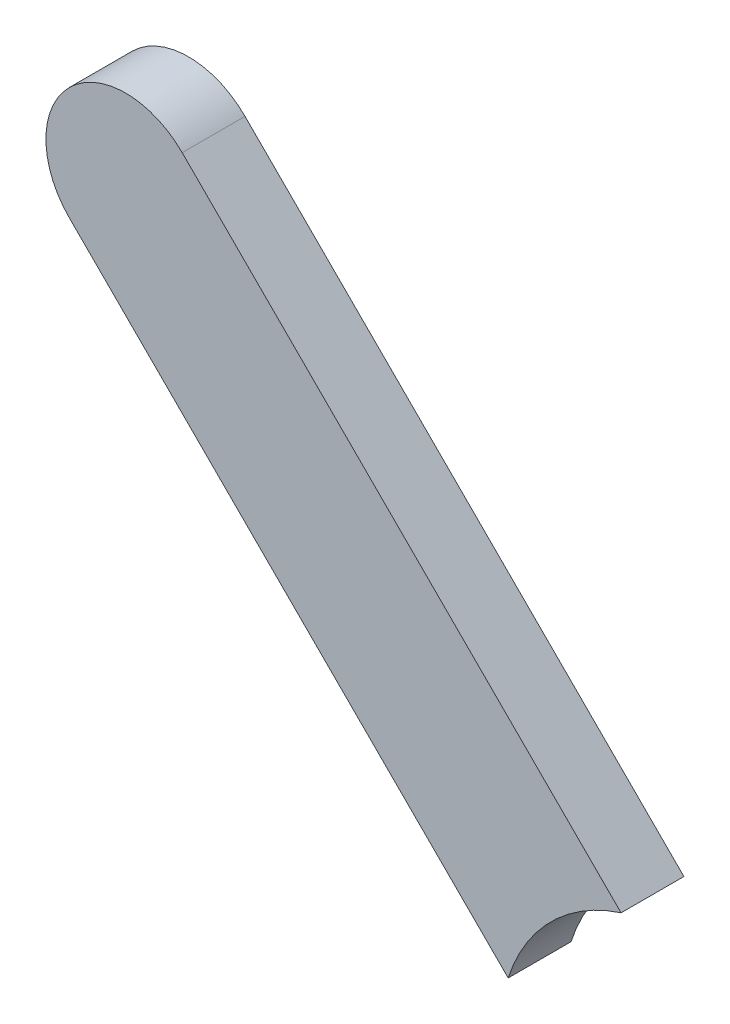
ISO-10303-21;
HEADER;
FILE_DESCRIPTION(('STEP AP214'),'2;1');
FILE_NAME('part.step','',(''),(''),'','','');
FILE_SCHEMA(('AUTOMOTIVE_DESIGN { 1 0 10303 214 1 1 1 1 }'));
ENDSEC;
DATA;
#1=APPLICATION_CONTEXT('core data for automotive mechanical design processes');
#2=APPLICATION_PROTOCOL_DEFINITION('international standard','automotive_design',2000,#1);
#3=PRODUCT_CONTEXT('',#1,'mechanical');
#4=PRODUCT('Part','Part','',(#3));
#5=PRODUCT_RELATED_PRODUCT_CATEGORY('part','',(#4));
#6=PRODUCT_DEFINITION_FORMATION('','',#4);
#7=PRODUCT_DEFINITION_CONTEXT('part definition',#1,'design');
#8=PRODUCT_DEFINITION('design','',#6,#7);
#9=PRODUCT_DEFINITION_SHAPE('','',#8);
#10=(LENGTH_UNIT() NAMED_UNIT(*) SI_UNIT(.MILLI.,.METRE.));
#11=(NAMED_UNIT(*) PLANE_ANGLE_UNIT() SI_UNIT($,.RADIAN.));
#12=(NAMED_UNIT(*) SI_UNIT($,.STERADIAN.) SOLID_ANGLE_UNIT());
#13=UNCERTAINTY_MEASURE_WITH_UNIT(LENGTH_MEASURE(1.E-05),#10,'distance_accuracy_value','');
#14=(GEOMETRIC_REPRESENTATION_CONTEXT(3) GLOBAL_UNCERTAINTY_ASSIGNED_CONTEXT((#13)) GLOBAL_UNIT_ASSIGNED_CONTEXT((#10,
#11,#12)) REPRESENTATION_CONTEXT('',''));
#15=CARTESIAN_POINT('',(0.,0.,0.));
#16=DIRECTION('',(0.,0.,1.));
#17=DIRECTION('',(1.,0.,0.));
#18=AXIS2_PLACEMENT_3D('',#15,#16,#17);
#19=CARTESIAN_POINT('',(127.09959086,110.40493286,0.));
#20=DIRECTION('',(0.707106781186548,0.707106781186548,0.));
#21=DIRECTION('',(0.707106781186548,-0.707106781186548,0.));
#22=AXIS2_PLACEMENT_3D('',#19,#20,#21);
#23=PLANE('',#22);
#24=DIRECTION('',(0.707106781186548,-0.707106781186548,0.));
#25=VECTOR('',#24,1.);
#26=CARTESIAN_POINT('',(127.09959086,110.40493286,0.1999996));
#27=LINE('',#26,#25);
#28=CARTESIAN_POINT('',(127.09959086,110.40493286,0.1999996));
#29=VERTEX_POINT('',#28);
#30=CARTESIAN_POINT('',(128.496196578856,109.008327141144,0.1999996));
#31=VERTEX_POINT('',#30);
#32=EDGE_CURVE('E11',#29,#31,#27,.T.);
#33=ORIENTED_EDGE('',*,*,#32,.F.);
#34=DIRECTION('',(0.,0.,1.));
#35=VECTOR('',#34,1.);
#36=CARTESIAN_POINT('',(127.09959086,110.40493286,0.));
#37=LINE('',#36,#35);
#38=CARTESIAN_POINT('',(127.09959086,110.40493286,0.));
#39=VERTEX_POINT('',#38);
#40=EDGE_CURVE('E24',#39,#29,#37,.T.);
#41=ORIENTED_EDGE('',*,*,#40,.F.);
#42=DIRECTION('',(0.707106781186548,-0.707106781186548,0.));
#43=VECTOR('',#42,1.);
#44=CARTESIAN_POINT('',(127.09959086,110.40493286,0.));
#45=LINE('',#44,#43);
#46=CARTESIAN_POINT('',(128.496196578856,109.008327141144,0.));
#47=VERTEX_POINT('',#46);
#48=EDGE_CURVE('E75',#39,#47,#45,.T.);
#49=ORIENTED_EDGE('',*,*,#48,.T.);
#50=DIRECTION('',(0.,0.,1.));
#51=VECTOR('',#50,1.);
#52=CARTESIAN_POINT('',(128.496196578856,109.008327141144,0.));
#53=LINE('',#52,#51);
#54=EDGE_CURVE('E37',#47,#31,#53,.T.);
#55=ORIENTED_EDGE('',*,*,#54,.T.);
#56=EDGE_LOOP('',(#33,#41,#49,#55));
#57=FACE_BOUND('',#56,.T.);
#58=ADVANCED_FACE('F17',(#57),#23,.F.);
#59=CARTESIAN_POINT('',(129.0247356,108.839,0.));
#60=DIRECTION('',(0.,0.,-1.));
#61=DIRECTION('',(1.,0.,0.));
#62=AXIS2_PLACEMENT_3D('',#59,#60,#61);
#63=CYLINDRICAL_SURFACE('',#62,0.55500016);
#64=DIRECTION('',(0.,0.,1.));
#65=VECTOR('',#64,1.);
#66=CARTESIAN_POINT('',(128.855408458856,109.367539021144,0.));
#67=LINE('',#66,#65);
#68=CARTESIAN_POINT('',(128.855408458856,109.367539021144,0.));
#69=VERTEX_POINT('',#68);
#70=CARTESIAN_POINT('',(128.855408458856,109.367539021144,0.1999996));
#71=VERTEX_POINT('',#70);
#72=EDGE_CURVE('E67',#69,#71,#67,.T.);
#73=ORIENTED_EDGE('',*,*,#72,.T.);
#74=CARTESIAN_POINT('',(129.0247356,108.839,0.1999996));
#75=DIRECTION('',(0.,0.,1.));
#76=DIRECTION('',(1.,0.,0.));
#77=AXIS2_PLACEMENT_3D('',#74,#75,#76);
#78=CIRCLE('',#77,0.55500016);
#79=EDGE_CURVE('E82',#71,#31,#78,.T.);
#80=ORIENTED_EDGE('',*,*,#79,.T.);
#81=ORIENTED_EDGE('',*,*,#54,.F.);
#82=CARTESIAN_POINT('',(129.0247356,108.839,0.));
#83=DIRECTION('',(0.,0.,1.));
#84=DIRECTION('',(1.,0.,0.));
#85=AXIS2_PLACEMENT_3D('',#82,#83,#84);
#86=CIRCLE('',#85,0.55500016);
#87=EDGE_CURVE('E80',#69,#47,#86,.T.);
#88=ORIENTED_EDGE('',*,*,#87,.F.);
#89=EDGE_LOOP('',(#73,#80,#81,#88));
#90=FACE_BOUND('',#89,.T.);
#91=ADVANCED_FACE('F88',(#90),#63,.F.);
#92=CARTESIAN_POINT('',(128.855408458856,109.367539021144,0.));
#93=DIRECTION('',(-0.707106781186548,-0.707106781186548,0.));
#94=DIRECTION('',(-0.707106781186548,0.707106781186548,0.));
#95=AXIS2_PLACEMENT_3D('',#92,#93,#94);
#96=PLANE('',#95);
#97=DIRECTION('',(-0.707106781186548,0.707106781186548,0.));
#98=VECTOR('',#97,1.);
#99=CARTESIAN_POINT('',(129.20434154,109.01860594,0.1999996));
#100=LINE('',#99,#98);
#101=CARTESIAN_POINT('',(127.45880274,110.76414474,0.1999996));
#102=VERTEX_POINT('',#101);
#103=EDGE_CURVE('E71',#71,#102,#100,.T.);
#104=ORIENTED_EDGE('',*,*,#103,.F.);
#105=ORIENTED_EDGE('',*,*,#72,.F.);
#106=DIRECTION('',(-0.707106781186548,0.707106781186548,0.));
#107=VECTOR('',#106,1.);
#108=CARTESIAN_POINT('',(129.20434154,109.01860594,0.));
#109=LINE('',#108,#107);
#110=CARTESIAN_POINT('',(127.45880274,110.76414474,0.));
#111=VERTEX_POINT('',#110);
#112=EDGE_CURVE('E63',#69,#111,#109,.T.);
#113=ORIENTED_EDGE('',*,*,#112,.T.);
#114=DIRECTION('',(0.,0.,1.));
#115=VECTOR('',#114,1.);
#116=CARTESIAN_POINT('',(127.45880274,110.76414474,0.));
#117=LINE('',#116,#115);
#118=EDGE_CURVE('E53',#111,#102,#117,.T.);
#119=ORIENTED_EDGE('',*,*,#118,.T.);
#120=EDGE_LOOP('',(#104,#105,#113,#119));
#121=FACE_BOUND('',#120,.T.);
#122=ADVANCED_FACE('F66',(#121),#96,.F.);
#123=CARTESIAN_POINT('',(127.2791968,110.5845388,0.));
#124=DIRECTION('',(0.,0.,-1.));
#125=DIRECTION('',(0.707106781186548,0.707106781186548,0.));
#126=AXIS2_PLACEMENT_3D('',#123,#124,#125);
#127=CYLINDRICAL_SURFACE('',#126,0.254001156230771);
#128=CARTESIAN_POINT('',(127.2791968,110.5845388,0.1999996));
#129=DIRECTION('',(0.,0.,1.));
#130=DIRECTION('',(0.707106781186548,0.707106781186548,0.));
#131=AXIS2_PLACEMENT_3D('',#128,#129,#130);
#132=CIRCLE('',#131,0.254001156230771);
#133=EDGE_CURVE('E59',#102,#29,#132,.T.);
#134=ORIENTED_EDGE('',*,*,#133,.F.);
#135=ORIENTED_EDGE('',*,*,#118,.F.);
#136=CARTESIAN_POINT('',(127.2791968,110.5845388,0.));
#137=DIRECTION('',(0.,0.,1.));
#138=DIRECTION('',(0.707106781186548,0.707106781186548,0.));
#139=AXIS2_PLACEMENT_3D('',#136,#137,#138);
#140=CIRCLE('',#139,0.254001156230771);
#141=EDGE_CURVE('E57',#111,#39,#140,.T.);
#142=ORIENTED_EDGE('',*,*,#141,.T.);
#143=ORIENTED_EDGE('',*,*,#40,.T.);
#144=EDGE_LOOP('',(#134,#135,#142,#143));
#145=FACE_BOUND('',#144,.T.);
#146=ADVANCED_FACE('F55',(#145),#127,.T.);
#147=CARTESIAN_POINT('',(127.09959086,110.40493286,0.));
#148=DIRECTION('',(0.,0.,-1.));
#149=DIRECTION('',(-1.,0.,0.));
#150=AXIS2_PLACEMENT_3D('',#147,#148,#149);
#151=PLANE('',#150);
#152=ORIENTED_EDGE('',*,*,#48,.F.);
#153=ORIENTED_EDGE('',*,*,#141,.F.);
#154=ORIENTED_EDGE('',*,*,#112,.F.);
#155=ORIENTED_EDGE('',*,*,#87,.T.);
#156=EDGE_LOOP('',(#152,#153,#154,#155));
#157=FACE_BOUND('',#156,.T.);
#158=ADVANCED_FACE('F74',(#157),#151,.T.);
#159=CARTESIAN_POINT('',(127.09959086,110.40493286,0.1999996));
#160=DIRECTION('',(0.,0.,-1.));
#161=DIRECTION('',(-1.,0.,0.));
#162=AXIS2_PLACEMENT_3D('',#159,#160,#161);
#163=PLANE('',#162);
#164=ORIENTED_EDGE('',*,*,#133,.T.);
#165=ORIENTED_EDGE('',*,*,#32,.T.);
#166=ORIENTED_EDGE('',*,*,#79,.F.);
#167=ORIENTED_EDGE('',*,*,#103,.T.);
#168=EDGE_LOOP('',(#164,#165,#166,#167));
#169=FACE_BOUND('',#168,.T.);
#170=ADVANCED_FACE('F91',(#169),#163,.F.);
#171=CLOSED_SHELL('',(#58,#91,#122,#146,#158,#170));
#172=MANIFOLD_SOLID_BREP('B1',#171);
#173=ADVANCED_BREP_SHAPE_REPRESENTATION('',(#18,#172),#14);
#174=SHAPE_DEFINITION_REPRESENTATION(#9,#173);
ENDSEC;
END-ISO-10303-21;
